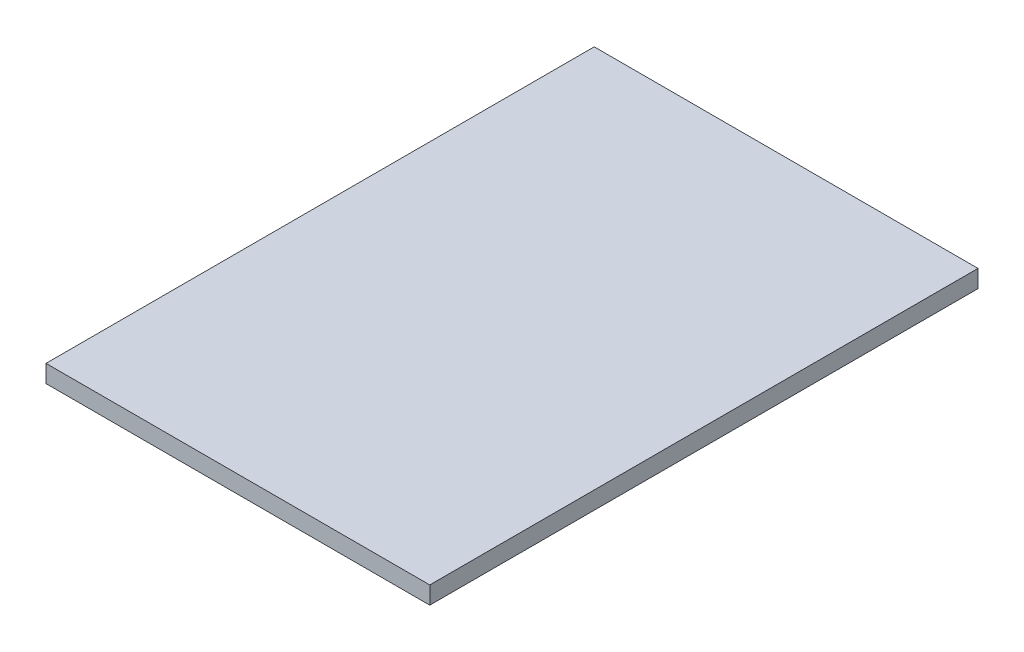
ISO-10303-21;
HEADER;
FILE_DESCRIPTION(('STEP AP214'),'2;1');
FILE_NAME('part.step','',(''),(''),'','','');
FILE_SCHEMA(('AUTOMOTIVE_DESIGN { 1 0 10303 214 1 1 1 1 }'));
ENDSEC;
DATA;
#1=APPLICATION_CONTEXT('core data for automotive mechanical design processes');
#2=APPLICATION_PROTOCOL_DEFINITION('international standard','automotive_design',2000,#1);
#3=PRODUCT_CONTEXT('',#1,'mechanical');
#4=PRODUCT('Part','Part','',(#3));
#5=PRODUCT_RELATED_PRODUCT_CATEGORY('part','',(#4));
#6=PRODUCT_DEFINITION_FORMATION('','',#4);
#7=PRODUCT_DEFINITION_CONTEXT('part definition',#1,'design');
#8=PRODUCT_DEFINITION('design','',#6,#7);
#9=PRODUCT_DEFINITION_SHAPE('','',#8);
#10=(LENGTH_UNIT() NAMED_UNIT(*) SI_UNIT(.MILLI.,.METRE.));
#11=(NAMED_UNIT(*) PLANE_ANGLE_UNIT() SI_UNIT($,.RADIAN.));
#12=(NAMED_UNIT(*) SI_UNIT($,.STERADIAN.) SOLID_ANGLE_UNIT());
#13=UNCERTAINTY_MEASURE_WITH_UNIT(LENGTH_MEASURE(1.E-05),#10,'distance_accuracy_value','');
#14=(GEOMETRIC_REPRESENTATION_CONTEXT(3) GLOBAL_UNCERTAINTY_ASSIGNED_CONTEXT((#13)) GLOBAL_UNIT_ASSIGNED_CONTEXT((#10,
#11,#12)) REPRESENTATION_CONTEXT('',''));
#15=CARTESIAN_POINT('',(0.,0.,0.));
#16=DIRECTION('',(0.,0.,1.));
#17=DIRECTION('',(1.,0.,0.));
#18=AXIS2_PLACEMENT_3D('',#15,#16,#17);
#19=CARTESIAN_POINT('',(17.5,1.6,-25.));
#20=DIRECTION('',(-1.,0.,0.));
#21=DIRECTION('',(0.,0.,1.));
#22=AXIS2_PLACEMENT_3D('',#19,#20,#21);
#23=PLANE('',#22);
#24=DIRECTION('',(0.,0.,-1.));
#25=VECTOR('',#24,1.);
#26=CARTESIAN_POINT('',(17.5,0.,-25.));
#27=LINE('',#26,#25);
#28=CARTESIAN_POINT('',(17.5,0.,25.));
#29=VERTEX_POINT('',#28);
#30=CARTESIAN_POINT('',(17.5,0.,-25.));
#31=VERTEX_POINT('',#30);
#32=EDGE_CURVE('E98',#29,#31,#27,.T.);
#33=ORIENTED_EDGE('',*,*,#32,.T.);
#34=DIRECTION('',(0.,-1.,0.));
#35=VECTOR('',#34,1.);
#36=CARTESIAN_POINT('',(17.5,1.6,-25.));
#37=LINE('',#36,#35);
#38=CARTESIAN_POINT('',(17.5,1.6,-25.));
#39=VERTEX_POINT('',#38);
#40=EDGE_CURVE('E11',#39,#31,#37,.T.);
#41=ORIENTED_EDGE('',*,*,#40,.F.);
#42=DIRECTION('',(0.,0.,-1.));
#43=VECTOR('',#42,1.);
#44=CARTESIAN_POINT('',(17.5,1.6,-25.));
#45=LINE('',#44,#43);
#46=CARTESIAN_POINT('',(17.5,1.6,25.));
#47=VERTEX_POINT('',#46);
#48=EDGE_CURVE('E86',#47,#39,#45,.T.);
#49=ORIENTED_EDGE('',*,*,#48,.F.);
#50=DIRECTION('',(0.,-1.,0.));
#51=VECTOR('',#50,1.);
#52=CARTESIAN_POINT('',(17.5,1.6,25.));
#53=LINE('',#52,#51);
#54=EDGE_CURVE('E94',#47,#29,#53,.T.);
#55=ORIENTED_EDGE('',*,*,#54,.T.);
#56=EDGE_LOOP('',(#33,#41,#49,#55));
#57=FACE_BOUND('',#56,.T.);
#58=ADVANCED_FACE('F35',(#57),#23,.F.);
#59=CARTESIAN_POINT('',(-17.5,1.6,-25.));
#60=DIRECTION('',(0.,0.,1.));
#61=DIRECTION('',(1.,0.,0.));
#62=AXIS2_PLACEMENT_3D('',#59,#60,#61);
#63=PLANE('',#62);
#64=DIRECTION('',(-1.,0.,0.));
#65=VECTOR('',#64,1.);
#66=CARTESIAN_POINT('',(-17.5,0.,-25.));
#67=LINE('',#66,#65);
#68=CARTESIAN_POINT('',(-17.5,0.,-25.));
#69=VERTEX_POINT('',#68);
#70=EDGE_CURVE('E90',#31,#69,#67,.T.);
#71=ORIENTED_EDGE('',*,*,#70,.T.);
#72=DIRECTION('',(0.,-1.,0.));
#73=VECTOR('',#72,1.);
#74=CARTESIAN_POINT('',(-17.5,1.6,-25.));
#75=LINE('',#74,#73);
#76=CARTESIAN_POINT('',(-17.5,1.6,-25.));
#77=VERTEX_POINT('',#76);
#78=EDGE_CURVE('E43',#77,#69,#75,.T.);
#79=ORIENTED_EDGE('',*,*,#78,.F.);
#80=DIRECTION('',(-1.,0.,0.));
#81=VECTOR('',#80,1.);
#82=CARTESIAN_POINT('',(-17.5,1.6,-25.));
#83=LINE('',#82,#81);
#84=EDGE_CURVE('E81',#39,#77,#83,.T.);
#85=ORIENTED_EDGE('',*,*,#84,.F.);
#86=ORIENTED_EDGE('',*,*,#40,.T.);
#87=EDGE_LOOP('',(#71,#79,#85,#86));
#88=FACE_BOUND('',#87,.T.);
#89=ADVANCED_FACE('F89',(#88),#63,.F.);
#90=CARTESIAN_POINT('',(-17.5,1.6,-25.));
#91=DIRECTION('',(1.,0.,0.));
#92=DIRECTION('',(0.,0.,-1.));
#93=AXIS2_PLACEMENT_3D('',#90,#91,#92);
#94=PLANE('',#93);
#95=DIRECTION('',(0.,0.,1.));
#96=VECTOR('',#95,1.);
#97=CARTESIAN_POINT('',(-17.5,0.,-25.));
#98=LINE('',#97,#96);
#99=CARTESIAN_POINT('',(-17.5,0.,25.));
#100=VERTEX_POINT('',#99);
#101=EDGE_CURVE('E68',#69,#100,#98,.T.);
#102=ORIENTED_EDGE('',*,*,#101,.T.);
#103=DIRECTION('',(0.,-1.,0.));
#104=VECTOR('',#103,1.);
#105=CARTESIAN_POINT('',(-17.5,1.6,25.));
#106=LINE('',#105,#104);
#107=CARTESIAN_POINT('',(-17.5,1.6,25.));
#108=VERTEX_POINT('',#107);
#109=EDGE_CURVE('E91',#108,#100,#106,.T.);
#110=ORIENTED_EDGE('',*,*,#109,.F.);
#111=DIRECTION('',(0.,0.,1.));
#112=VECTOR('',#111,1.);
#113=CARTESIAN_POINT('',(-17.5,1.6,-25.));
#114=LINE('',#113,#112);
#115=EDGE_CURVE('E84',#77,#108,#114,.T.);
#116=ORIENTED_EDGE('',*,*,#115,.F.);
#117=ORIENTED_EDGE('',*,*,#78,.T.);
#118=EDGE_LOOP('',(#102,#110,#116,#117));
#119=FACE_BOUND('',#118,.T.);
#120=ADVANCED_FACE('F92',(#119),#94,.F.);
#121=CARTESIAN_POINT('',(-17.5,1.6,25.));
#122=DIRECTION('',(0.,0.,-1.));
#123=DIRECTION('',(-1.,0.,0.));
#124=AXIS2_PLACEMENT_3D('',#121,#122,#123);
#125=PLANE('',#124);
#126=DIRECTION('',(1.,0.,0.));
#127=VECTOR('',#126,1.);
#128=CARTESIAN_POINT('',(-17.5,0.,25.));
#129=LINE('',#128,#127);
#130=EDGE_CURVE('E74',#100,#29,#129,.T.);
#131=ORIENTED_EDGE('',*,*,#130,.T.);
#132=ORIENTED_EDGE('',*,*,#54,.F.);
#133=DIRECTION('',(1.,0.,0.));
#134=VECTOR('',#133,1.);
#135=CARTESIAN_POINT('',(-17.5,1.6,25.));
#136=LINE('',#135,#134);
#137=EDGE_CURVE('E51',#108,#47,#136,.T.);
#138=ORIENTED_EDGE('',*,*,#137,.F.);
#139=ORIENTED_EDGE('',*,*,#109,.T.);
#140=EDGE_LOOP('',(#131,#132,#138,#139));
#141=FACE_BOUND('',#140,.T.);
#142=ADVANCED_FACE('F105',(#141),#125,.F.);
#143=CARTESIAN_POINT('',(0.,1.6,0.));
#144=DIRECTION('',(0.,1.,0.));
#145=DIRECTION('',(0.,0.,1.));
#146=AXIS2_PLACEMENT_3D('',#143,#144,#145);
#147=PLANE('',#146);
#148=ORIENTED_EDGE('',*,*,#48,.T.);
#149=ORIENTED_EDGE('',*,*,#84,.T.);
#150=ORIENTED_EDGE('',*,*,#115,.T.);
#151=ORIENTED_EDGE('',*,*,#137,.T.);
#152=EDGE_LOOP('',(#148,#149,#150,#151));
#153=FACE_BOUND('',#152,.T.);
#154=ADVANCED_FACE('F82',(#153),#147,.T.);
#155=CARTESIAN_POINT('',(0.,0.,0.));
#156=DIRECTION('',(0.,1.,0.));
#157=DIRECTION('',(0.,0.,1.));
#158=AXIS2_PLACEMENT_3D('',#155,#156,#157);
#159=PLANE('',#158);
#160=ORIENTED_EDGE('',*,*,#32,.F.);
#161=ORIENTED_EDGE('',*,*,#130,.F.);
#162=ORIENTED_EDGE('',*,*,#101,.F.);
#163=ORIENTED_EDGE('',*,*,#70,.F.);
#164=EDGE_LOOP('',(#160,#161,#162,#163));
#165=FACE_BOUND('',#164,.T.);
#166=ADVANCED_FACE('F108',(#165),#159,.F.);
#167=CLOSED_SHELL('',(#58,#89,#120,#142,#154,#166));
#168=MANIFOLD_SOLID_BREP('B2',#167);
#169=ADVANCED_BREP_SHAPE_REPRESENTATION('',(#18,#168),#14);
#170=SHAPE_DEFINITION_REPRESENTATION(#9,#169);
ENDSEC;
END-ISO-10303-21;
